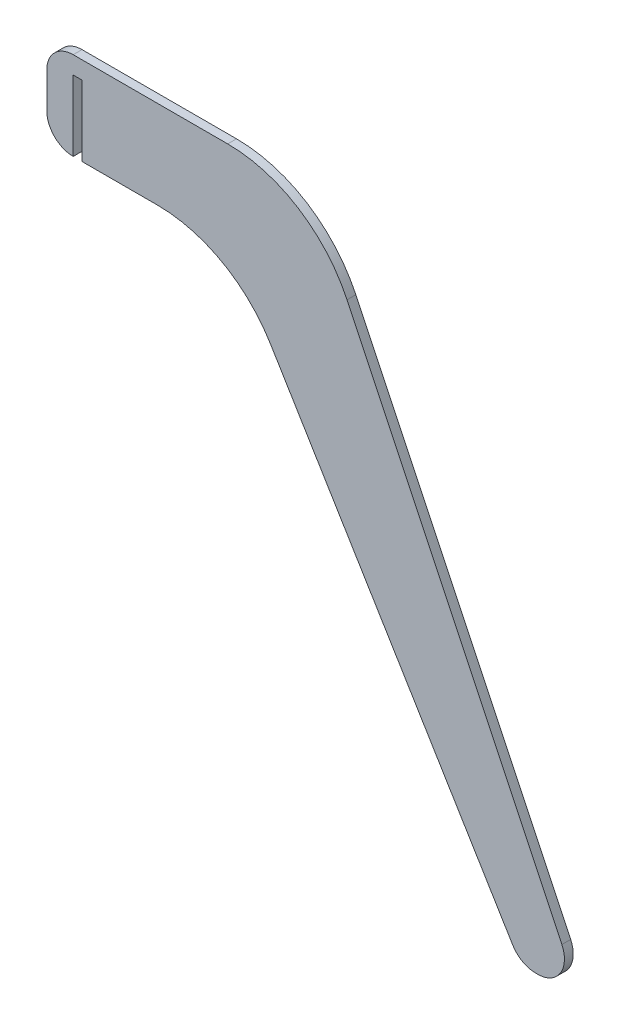
ISO-10303-21;
HEADER;
FILE_DESCRIPTION(('STEP AP214'),'2;1');
FILE_NAME('part.step','',(''),(''),'','','');
FILE_SCHEMA(('AUTOMOTIVE_DESIGN { 1 0 10303 214 1 1 1 1 }'));
ENDSEC;
DATA;
#1=APPLICATION_CONTEXT('core data for automotive mechanical design processes');
#2=APPLICATION_PROTOCOL_DEFINITION('international standard','automotive_design',2000,#1);
#3=PRODUCT_CONTEXT('',#1,'mechanical');
#4=PRODUCT('Part','Part','',(#3));
#5=PRODUCT_RELATED_PRODUCT_CATEGORY('part','',(#4));
#6=PRODUCT_DEFINITION_FORMATION('','',#4);
#7=PRODUCT_DEFINITION_CONTEXT('part definition',#1,'design');
#8=PRODUCT_DEFINITION('design','',#6,#7);
#9=PRODUCT_DEFINITION_SHAPE('','',#8);
#10=(LENGTH_UNIT() NAMED_UNIT(*) SI_UNIT(.MILLI.,.METRE.));
#11=(NAMED_UNIT(*) PLANE_ANGLE_UNIT() SI_UNIT($,.RADIAN.));
#12=(NAMED_UNIT(*) SI_UNIT($,.STERADIAN.) SOLID_ANGLE_UNIT());
#13=UNCERTAINTY_MEASURE_WITH_UNIT(LENGTH_MEASURE(1.E-05),#10,'distance_accuracy_value','');
#14=(GEOMETRIC_REPRESENTATION_CONTEXT(3) GLOBAL_UNCERTAINTY_ASSIGNED_CONTEXT((#13)) GLOBAL_UNIT_ASSIGNED_CONTEXT((#10,
#11,#12)) REPRESENTATION_CONTEXT('',''));
#15=CARTESIAN_POINT('',(0.,0.,0.));
#16=DIRECTION('',(0.,0.,1.));
#17=DIRECTION('',(1.,0.,0.));
#18=AXIS2_PLACEMENT_3D('',#15,#16,#17);
#19=CARTESIAN_POINT('',(0.3,0.,0.1));
#20=DIRECTION('',(-1.,0.,0.));
#21=DIRECTION('',(0.,0.,1.));
#22=AXIS2_PLACEMENT_3D('',#19,#20,#21);
#23=PLANE('',#22);
#24=DIRECTION('',(0.,1.,0.));
#25=VECTOR('',#24,1.);
#26=CARTESIAN_POINT('',(0.3,0.,0.));
#27=LINE('',#26,#25);
#28=CARTESIAN_POINT('',(0.3,0.,0.));
#29=VERTEX_POINT('',#28);
#30=CARTESIAN_POINT('',(0.3,0.8,0.));
#31=VERTEX_POINT('',#30);
#32=EDGE_CURVE('E296',#29,#31,#27,.T.);
#33=ORIENTED_EDGE('',*,*,#32,.T.);
#34=DIRECTION('',(0.,0.,-1.));
#35=VECTOR('',#34,1.);
#36=CARTESIAN_POINT('',(0.3,0.8,0.1));
#37=LINE('',#36,#35);
#38=CARTESIAN_POINT('',(0.3,0.8,0.1));
#39=VERTEX_POINT('',#38);
#40=EDGE_CURVE('E165',#39,#31,#37,.T.);
#41=ORIENTED_EDGE('',*,*,#40,.F.);
#42=DIRECTION('',(0.,1.,0.));
#43=VECTOR('',#42,1.);
#44=CARTESIAN_POINT('',(0.3,0.,0.1));
#45=LINE('',#44,#43);
#46=CARTESIAN_POINT('',(0.3,0.,0.1));
#47=VERTEX_POINT('',#46);
#48=EDGE_CURVE('E150',#47,#39,#45,.T.);
#49=ORIENTED_EDGE('',*,*,#48,.F.);
#50=DIRECTION('',(0.,0.,-1.));
#51=VECTOR('',#50,1.);
#52=CARTESIAN_POINT('',(0.3,0.,0.1));
#53=LINE('',#52,#51);
#54=EDGE_CURVE('E163',#47,#29,#53,.T.);
#55=ORIENTED_EDGE('',*,*,#54,.T.);
#56=EDGE_LOOP('',(#33,#41,#49,#55));
#57=FACE_BOUND('',#56,.T.);
#58=ADVANCED_FACE('F39',(#57),#23,.F.);
#59=CARTESIAN_POINT('',(0.3,0.8,0.1));
#60=DIRECTION('',(0.,1.,0.));
#61=DIRECTION('',(0.,0.,1.));
#62=AXIS2_PLACEMENT_3D('',#59,#60,#61);
#63=PLANE('',#62);
#64=DIRECTION('',(1.,0.,0.));
#65=VECTOR('',#64,1.);
#66=CARTESIAN_POINT('',(0.3,0.8,0.));
#67=LINE('',#66,#65);
#68=CARTESIAN_POINT('',(0.4,0.8,0.));
#69=VERTEX_POINT('',#68);
#70=EDGE_CURVE('E290',#31,#69,#67,.T.);
#71=ORIENTED_EDGE('',*,*,#70,.T.);
#72=DIRECTION('',(0.,0.,-1.));
#73=VECTOR('',#72,1.);
#74=CARTESIAN_POINT('',(0.4,0.8,0.1));
#75=LINE('',#74,#73);
#76=CARTESIAN_POINT('',(0.4,0.8,0.1));
#77=VERTEX_POINT('',#76);
#78=EDGE_CURVE('E182',#77,#69,#75,.T.);
#79=ORIENTED_EDGE('',*,*,#78,.F.);
#80=DIRECTION('',(1.,0.,0.));
#81=VECTOR('',#80,1.);
#82=CARTESIAN_POINT('',(0.3,0.8,0.1));
#83=LINE('',#82,#81);
#84=EDGE_CURVE('E168',#39,#77,#83,.T.);
#85=ORIENTED_EDGE('',*,*,#84,.F.);
#86=ORIENTED_EDGE('',*,*,#40,.T.);
#87=EDGE_LOOP('',(#71,#79,#85,#86));
#88=FACE_BOUND('',#87,.T.);
#89=ADVANCED_FACE('F321',(#88),#63,.F.);
#90=CARTESIAN_POINT('',(0.4,0.8,0.1));
#91=DIRECTION('',(1.,0.,0.));
#92=DIRECTION('',(0.,1.,0.));
#93=AXIS2_PLACEMENT_3D('',#90,#91,#92);
#94=PLANE('',#93);
#95=DIRECTION('',(0.,-1.,0.));
#96=VECTOR('',#95,1.);
#97=CARTESIAN_POINT('',(0.4,0.8,0.));
#98=LINE('',#97,#96);
#99=CARTESIAN_POINT('',(0.4,0.,0.));
#100=VERTEX_POINT('',#99);
#101=EDGE_CURVE('E285',#69,#100,#98,.T.);
#102=ORIENTED_EDGE('',*,*,#101,.T.);
#103=DIRECTION('',(0.,0.,-1.));
#104=VECTOR('',#103,1.);
#105=CARTESIAN_POINT('',(0.4,0.,0.1));
#106=LINE('',#105,#104);
#107=CARTESIAN_POINT('',(0.4,0.,0.1));
#108=VERTEX_POINT('',#107);
#109=EDGE_CURVE('E274',#108,#100,#106,.T.);
#110=ORIENTED_EDGE('',*,*,#109,.F.);
#111=DIRECTION('',(0.,-1.,0.));
#112=VECTOR('',#111,1.);
#113=CARTESIAN_POINT('',(0.4,0.8,0.1));
#114=LINE('',#113,#112);
#115=EDGE_CURVE('E286',#77,#108,#114,.T.);
#116=ORIENTED_EDGE('',*,*,#115,.F.);
#117=ORIENTED_EDGE('',*,*,#78,.T.);
#118=EDGE_LOOP('',(#102,#110,#116,#117));
#119=FACE_BOUND('',#118,.T.);
#120=ADVANCED_FACE('F283',(#119),#94,.F.);
#121=CARTESIAN_POINT('',(0.4,0.,0.1));
#122=DIRECTION('',(0.,1.,0.));
#123=DIRECTION('',(-1.,0.,0.));
#124=AXIS2_PLACEMENT_3D('',#121,#122,#123);
#125=PLANE('',#124);
#126=DIRECTION('',(1.,0.,0.));
#127=VECTOR('',#126,1.);
#128=CARTESIAN_POINT('',(0.4,0.,0.));
#129=LINE('',#128,#127);
#130=CARTESIAN_POINT('',(1.25539714086741,0.,0.));
#131=VERTEX_POINT('',#130);
#132=EDGE_CURVE('E264',#100,#131,#129,.T.);
#133=ORIENTED_EDGE('',*,*,#132,.T.);
#134=DIRECTION('',(0.,0.,-1.));
#135=VECTOR('',#134,1.);
#136=CARTESIAN_POINT('',(1.25539714086741,0.,0.1));
#137=LINE('',#136,#135);
#138=CARTESIAN_POINT('',(1.25539714086741,0.,0.1));
#139=VERTEX_POINT('',#138);
#140=EDGE_CURVE('E180',#131,#139,#137,.F.);
#141=ORIENTED_EDGE('',*,*,#140,.T.);
#142=DIRECTION('',(1.,0.,0.));
#143=VECTOR('',#142,1.);
#144=CARTESIAN_POINT('',(0.4,0.,0.1));
#145=LINE('',#144,#143);
#146=EDGE_CURVE('E314',#108,#139,#145,.T.);
#147=ORIENTED_EDGE('',*,*,#146,.F.);
#148=ORIENTED_EDGE('',*,*,#109,.T.);
#149=EDGE_LOOP('',(#133,#141,#147,#148));
#150=FACE_BOUND('',#149,.T.);
#151=ADVANCED_FACE('F328',(#150),#125,.F.);
#152=CARTESIAN_POINT('',(5.37542131627612,-5.40091248726071,0.1));
#153=DIRECTION('',(0.855047552956308,0.518549594719184,0.));
#154=DIRECTION('',(-0.518549594719184,0.855047552956308,0.));
#155=AXIS2_PLACEMENT_3D('',#152,#153,#154);
#156=PLANE('',#155);
#157=DIRECTION('',(0.518549594719184,-0.855047552956308,0.));
#158=VECTOR('',#157,1.);
#159=CARTESIAN_POINT('',(5.37542131627612,-5.40091248726071,0.));
#160=LINE('',#159,#158);
#161=CARTESIAN_POINT('',(2.53796847030187,-0.722175607921225,0.));
#162=VERTEX_POINT('',#161);
#163=CARTESIAN_POINT('',(5.28782762221574,-5.25647736567647,0.));
#164=VERTEX_POINT('',#163);
#165=EDGE_CURVE('E258',#162,#164,#160,.T.);
#166=ORIENTED_EDGE('',*,*,#165,.T.);
#167=DIRECTION('',(0.,0.,-1.));
#168=VECTOR('',#167,1.);
#169=CARTESIAN_POINT('',(5.28782762221574,-5.25647736567647,0.1));
#170=LINE('',#169,#168);
#171=CARTESIAN_POINT('',(5.28782762221574,-5.25647736567647,0.1));
#172=VERTEX_POINT('',#171);
#173=EDGE_CURVE('E11',#164,#172,#170,.F.);
#174=ORIENTED_EDGE('',*,*,#173,.T.);
#175=DIRECTION('',(0.518549594719184,-0.855047552956308,0.));
#176=VECTOR('',#175,1.);
#177=CARTESIAN_POINT('',(5.37542131627612,-5.40091248726071,0.1));
#178=LINE('',#177,#176);
#179=CARTESIAN_POINT('',(2.53796847030187,-0.722175607921225,0.1));
#180=VERTEX_POINT('',#179);
#181=EDGE_CURVE('E311',#180,#172,#178,.T.);
#182=ORIENTED_EDGE('',*,*,#181,.F.);
#183=DIRECTION('',(0.,0.,-1.));
#184=VECTOR('',#183,1.);
#185=CARTESIAN_POINT('',(2.53796847030187,-0.722175607921224,0.));
#186=LINE('',#185,#184);
#187=EDGE_CURVE('E175',#180,#162,#186,.T.);
#188=ORIENTED_EDGE('',*,*,#187,.T.);
#189=EDGE_LOOP('',(#166,#174,#182,#188));
#190=FACE_BOUND('',#189,.T.);
#191=ADVANCED_FACE('F383',(#190),#156,.F.);
#192=CARTESIAN_POINT('',(6.04949513941477,-5.40091248726071,0.1));
#193=DIRECTION('',(0.,1.,0.));
#194=DIRECTION('',(0.,0.,1.));
#195=AXIS2_PLACEMENT_3D('',#192,#193,#194);
#196=PLANE('',#195);
#197=DIRECTION('',(1.,0.,0.));
#198=VECTOR('',#197,1.);
#199=CARTESIAN_POINT('',(6.04949513941477,-5.40091248726071,0.));
#200=LINE('',#199,#198);
#201=CARTESIAN_POINT('',(5.54434188810264,-5.40091248726071,0.));
#202=VERTEX_POINT('',#201);
#203=CARTESIAN_POINT('',(5.57426414015044,-5.40091248726071,0.));
#204=VERTEX_POINT('',#203);
#205=EDGE_CURVE('E247',#202,#204,#200,.T.);
#206=ORIENTED_EDGE('',*,*,#205,.T.);
#207=DIRECTION('',(0.,0.,-1.));
#208=VECTOR('',#207,1.);
#209=CARTESIAN_POINT('',(5.57426414015044,-5.40091248726071,0.1));
#210=LINE('',#209,#208);
#211=CARTESIAN_POINT('',(5.57426414015044,-5.40091248726071,0.1));
#212=VERTEX_POINT('',#211);
#213=EDGE_CURVE('E48',#204,#212,#210,.F.);
#214=ORIENTED_EDGE('',*,*,#213,.T.);
#215=DIRECTION('',(1.,0.,0.));
#216=VECTOR('',#215,1.);
#217=CARTESIAN_POINT('',(6.04949513941477,-5.40091248726071,0.1));
#218=LINE('',#217,#216);
#219=CARTESIAN_POINT('',(5.54434188810264,-5.40091248726071,0.1));
#220=VERTEX_POINT('',#219);
#221=EDGE_CURVE('E248',#220,#212,#218,.T.);
#222=ORIENTED_EDGE('',*,*,#221,.F.);
#223=DIRECTION('',(0.,0.,-1.));
#224=VECTOR('',#223,1.);
#225=CARTESIAN_POINT('',(5.54434188810264,-5.40091248726071,0.1));
#226=LINE('',#225,#224);
#227=EDGE_CURVE('E240',#220,#202,#226,.T.);
#228=ORIENTED_EDGE('',*,*,#227,.T.);
#229=EDGE_LOOP('',(#206,#214,#222,#228));
#230=FACE_BOUND('',#229,.T.);
#231=ADVANCED_FACE('F246',(#230),#196,.F.);
#232=CARTESIAN_POINT('',(3.,1.,0.1));
#233=DIRECTION('',(-0.902781581302182,-0.430099309998902,0.));
#234=DIRECTION('',(0.430099309998902,-0.902781581302182,0.));
#235=AXIS2_PLACEMENT_3D('',#232,#233,#234);
#236=PLANE('',#235);
#237=DIRECTION('',(-0.430099309998902,0.902781581302182,0.));
#238=VECTOR('',#237,1.);
#239=CARTESIAN_POINT('',(3.,1.,0.1));
#240=LINE('',#239,#238);
#241=CARTESIAN_POINT('',(5.8450986145411,-4.97188269426104,0.1));
#242=VERTEX_POINT('',#241);
#243=CARTESIAN_POINT('',(3.40726444570981,0.145148964998353,0.1));
#244=VERTEX_POINT('',#243);
#245=EDGE_CURVE('E306',#242,#244,#240,.T.);
#246=ORIENTED_EDGE('',*,*,#245,.F.);
#247=DIRECTION('',(0.,0.,-1.));
#248=VECTOR('',#247,1.);
#249=CARTESIAN_POINT('',(5.8450986145411,-4.97188269426104,0.1));
#250=LINE('',#249,#248);
#251=CARTESIAN_POINT('',(5.8450986145411,-4.97188269426104,0.));
#252=VERTEX_POINT('',#251);
#253=EDGE_CURVE('E236',#242,#252,#250,.T.);
#254=ORIENTED_EDGE('',*,*,#253,.T.);
#255=DIRECTION('',(-0.430099309998902,0.902781581302182,0.));
#256=VECTOR('',#255,1.);
#257=CARTESIAN_POINT('',(3.,1.,0.));
#258=LINE('',#257,#256);
#259=CARTESIAN_POINT('',(3.40726444570981,0.145148964998353,0.));
#260=VERTEX_POINT('',#259);
#261=EDGE_CURVE('E257',#252,#260,#258,.T.);
#262=ORIENTED_EDGE('',*,*,#261,.T.);
#263=DIRECTION('',(0.,0.,-1.));
#264=VECTOR('',#263,1.);
#265=CARTESIAN_POINT('',(3.40726444570981,0.145148964998353,0.1));
#266=LINE('',#265,#264);
#267=EDGE_CURVE('E196',#260,#244,#266,.F.);
#268=ORIENTED_EDGE('',*,*,#267,.T.);
#269=EDGE_LOOP('',(#246,#254,#262,#268));
#270=FACE_BOUND('',#269,.T.);
#271=ADVANCED_FACE('F356',(#270),#236,.F.);
#272=CARTESIAN_POINT('',(0.,1.,0.1));
#273=DIRECTION('',(0.,-1.,0.));
#274=DIRECTION('',(0.,0.,-1.));
#275=AXIS2_PLACEMENT_3D('',#272,#273,#274);
#276=PLANE('',#275);
#277=DIRECTION('',(-1.,0.,0.));
#278=VECTOR('',#277,1.);
#279=CARTESIAN_POINT('',(0.,1.,0.));
#280=LINE('',#279,#278);
#281=CARTESIAN_POINT('',(2.05309207375653,1.,0.));
#282=VERTEX_POINT('',#281);
#283=CARTESIAN_POINT('',(0.3,1.,0.));
#284=VERTEX_POINT('',#283);
#285=EDGE_CURVE('E262',#282,#284,#280,.T.);
#286=ORIENTED_EDGE('',*,*,#285,.T.);
#287=DIRECTION('',(0.,0.,-1.));
#288=VECTOR('',#287,1.);
#289=CARTESIAN_POINT('',(0.3,1.,0.1));
#290=LINE('',#289,#288);
#291=CARTESIAN_POINT('',(0.3,1.,0.1));
#292=VERTEX_POINT('',#291);
#293=EDGE_CURVE('E227',#284,#292,#290,.F.);
#294=ORIENTED_EDGE('',*,*,#293,.T.);
#295=DIRECTION('',(-1.,0.,0.));
#296=VECTOR('',#295,1.);
#297=CARTESIAN_POINT('',(0.,1.,0.1));
#298=LINE('',#297,#296);
#299=CARTESIAN_POINT('',(2.05309207375653,1.,0.1));
#300=VERTEX_POINT('',#299);
#301=EDGE_CURVE('E303',#300,#292,#298,.T.);
#302=ORIENTED_EDGE('',*,*,#301,.F.);
#303=DIRECTION('',(0.,0.,-1.));
#304=VECTOR('',#303,1.);
#305=CARTESIAN_POINT('',(2.05309207375653,1.,0.1));
#306=LINE('',#305,#304);
#307=EDGE_CURVE('E188',#300,#282,#306,.T.);
#308=ORIENTED_EDGE('',*,*,#307,.T.);
#309=EDGE_LOOP('',(#286,#294,#302,#308));
#310=FACE_BOUND('',#309,.T.);
#311=ADVANCED_FACE('F363',(#310),#276,.F.);
#312=CARTESIAN_POINT('',(0.,0.,0.1));
#313=DIRECTION('',(1.,0.,0.));
#314=DIRECTION('',(0.,0.,-1.));
#315=AXIS2_PLACEMENT_3D('',#312,#313,#314);
#316=PLANE('',#315);
#317=DIRECTION('',(0.,-1.,0.));
#318=VECTOR('',#317,1.);
#319=CARTESIAN_POINT('',(0.,0.,0.1));
#320=LINE('',#319,#318);
#321=CARTESIAN_POINT('',(0.,0.7,0.1));
#322=VERTEX_POINT('',#321);
#323=CARTESIAN_POINT('',(0.,0.3,0.1));
#324=VERTEX_POINT('',#323);
#325=EDGE_CURVE('E153',#322,#324,#320,.T.);
#326=ORIENTED_EDGE('',*,*,#325,.F.);
#327=DIRECTION('',(0.,0.,-1.));
#328=VECTOR('',#327,1.);
#329=CARTESIAN_POINT('',(0.,0.7,0.1));
#330=LINE('',#329,#328);
#331=CARTESIAN_POINT('',(0.,0.7,0.));
#332=VERTEX_POINT('',#331);
#333=EDGE_CURVE('E212',#322,#332,#330,.T.);
#334=ORIENTED_EDGE('',*,*,#333,.T.);
#335=DIRECTION('',(0.,-1.,0.));
#336=VECTOR('',#335,1.);
#337=CARTESIAN_POINT('',(0.,0.,0.));
#338=LINE('',#337,#336);
#339=CARTESIAN_POINT('',(0.,0.3,0.));
#340=VERTEX_POINT('',#339);
#341=EDGE_CURVE('E169',#332,#340,#338,.T.);
#342=ORIENTED_EDGE('',*,*,#341,.T.);
#343=DIRECTION('',(0.,0.,-1.));
#344=VECTOR('',#343,1.);
#345=CARTESIAN_POINT('',(0.,0.3,0.1));
#346=LINE('',#345,#344);
#347=EDGE_CURVE('E209',#340,#324,#346,.F.);
#348=ORIENTED_EDGE('',*,*,#347,.T.);
#349=EDGE_LOOP('',(#326,#334,#342,#348));
#350=FACE_BOUND('',#349,.T.);
#351=ADVANCED_FACE('F368',(#350),#316,.F.);
#352=CARTESIAN_POINT('',(0.,0.,0.1));
#353=DIRECTION('',(0.,0.,1.));
#354=DIRECTION('',(1.,0.,0.));
#355=AXIS2_PLACEMENT_3D('',#352,#353,#354);
#356=PLANE('',#355);
#357=ORIENTED_EDGE('',*,*,#301,.T.);
#358=CARTESIAN_POINT('',(0.3,0.7,0.1));
#359=DIRECTION('',(0.,0.,1.));
#360=DIRECTION('',(1.,0.,0.));
#361=AXIS2_PLACEMENT_3D('',#358,#359,#360);
#362=CIRCLE('',#361,0.3);
#363=EDGE_CURVE('E158',#292,#322,#362,.T.);
#364=ORIENTED_EDGE('',*,*,#363,.T.);
#365=ORIENTED_EDGE('',*,*,#325,.T.);
#366=CARTESIAN_POINT('',(0.3,0.3,0.1));
#367=DIRECTION('',(0.,0.,1.));
#368=DIRECTION('',(1.,0.,0.));
#369=AXIS2_PLACEMENT_3D('',#366,#367,#368);
#370=CIRCLE('',#369,0.3);
#371=EDGE_CURVE('E146',#324,#47,#370,.T.);
#372=ORIENTED_EDGE('',*,*,#371,.T.);
#373=ORIENTED_EDGE('',*,*,#48,.T.);
#374=ORIENTED_EDGE('',*,*,#84,.T.);
#375=ORIENTED_EDGE('',*,*,#115,.T.);
#376=ORIENTED_EDGE('',*,*,#146,.T.);
#377=CARTESIAN_POINT('',(1.25539714086741,-1.5,0.1));
#378=DIRECTION('',(0.,0.,1.));
#379=DIRECTION('',(1.,0.,0.));
#380=AXIS2_PLACEMENT_3D('',#377,#378,#379);
#381=CIRCLE('',#380,1.5);
#382=EDGE_CURVE('E206',#139,#180,#381,.F.);
#383=ORIENTED_EDGE('',*,*,#382,.T.);
#384=ORIENTED_EDGE('',*,*,#181,.T.);
#385=CARTESIAN_POINT('',(5.54434188810264,-5.10091248726071,0.1));
#386=DIRECTION('',(0.,0.,1.));
#387=DIRECTION('',(1.,0.,0.));
#388=AXIS2_PLACEMENT_3D('',#385,#386,#387);
#389=CIRCLE('',#388,0.3);
#390=EDGE_CURVE('E61',#172,#220,#389,.T.);
#391=ORIENTED_EDGE('',*,*,#390,.T.);
#392=ORIENTED_EDGE('',*,*,#221,.T.);
#393=CARTESIAN_POINT('',(5.57426414015044,-5.10091248726071,0.1));
#394=DIRECTION('',(0.,0.,1.));
#395=DIRECTION('',(1.,0.,0.));
#396=AXIS2_PLACEMENT_3D('',#393,#394,#395);
#397=CIRCLE('',#396,0.3);
#398=EDGE_CURVE('E159',#212,#242,#397,.T.);
#399=ORIENTED_EDGE('',*,*,#398,.T.);
#400=ORIENTED_EDGE('',*,*,#245,.T.);
#401=CARTESIAN_POINT('',(2.05309207375653,-0.5,0.1));
#402=DIRECTION('',(0.,0.,1.));
#403=DIRECTION('',(1.,0.,0.));
#404=AXIS2_PLACEMENT_3D('',#401,#402,#403);
#405=CIRCLE('',#404,1.5);
#406=EDGE_CURVE('E200',#244,#300,#405,.T.);
#407=ORIENTED_EDGE('',*,*,#406,.T.);
#408=EDGE_LOOP('',(#357,#364,#365,#372,#373,#374,#375,#376,#383,#384,#391,#392,#399,#400,#407));
#409=FACE_BOUND('',#408,.T.);
#410=ADVANCED_FACE('F149',(#409),#356,.T.);
#411=CARTESIAN_POINT('',(0.,0.,0.));
#412=DIRECTION('',(0.,0.,1.));
#413=DIRECTION('',(1.,0.,0.));
#414=AXIS2_PLACEMENT_3D('',#411,#412,#413);
#415=PLANE('',#414);
#416=ORIENTED_EDGE('',*,*,#341,.F.);
#417=CARTESIAN_POINT('',(0.3,0.7,0.));
#418=DIRECTION('',(0.,0.,1.));
#419=DIRECTION('',(1.,0.,0.));
#420=AXIS2_PLACEMENT_3D('',#417,#418,#419);
#421=CIRCLE('',#420,0.3);
#422=EDGE_CURVE('E224',#332,#284,#421,.F.);
#423=ORIENTED_EDGE('',*,*,#422,.T.);
#424=ORIENTED_EDGE('',*,*,#285,.F.);
#425=CARTESIAN_POINT('',(2.05309207375653,-0.5,0.));
#426=DIRECTION('',(0.,0.,1.));
#427=DIRECTION('',(1.,0.,0.));
#428=AXIS2_PLACEMENT_3D('',#425,#426,#427);
#429=CIRCLE('',#428,1.5);
#430=EDGE_CURVE('E192',#282,#260,#429,.F.);
#431=ORIENTED_EDGE('',*,*,#430,.T.);
#432=ORIENTED_EDGE('',*,*,#261,.F.);
#433=CARTESIAN_POINT('',(5.57426414015044,-5.10091248726071,0.));
#434=DIRECTION('',(0.,0.,1.));
#435=DIRECTION('',(1.,0.,0.));
#436=AXIS2_PLACEMENT_3D('',#433,#434,#435);
#437=CIRCLE('',#436,0.3);
#438=EDGE_CURVE('E219',#252,#204,#437,.F.);
#439=ORIENTED_EDGE('',*,*,#438,.T.);
#440=ORIENTED_EDGE('',*,*,#205,.F.);
#441=CARTESIAN_POINT('',(5.54434188810264,-5.10091248726071,0.));
#442=DIRECTION('',(0.,0.,1.));
#443=DIRECTION('',(1.,0.,0.));
#444=AXIS2_PLACEMENT_3D('',#441,#442,#443);
#445=CIRCLE('',#444,0.3);
#446=EDGE_CURVE('E216',#202,#164,#445,.F.);
#447=ORIENTED_EDGE('',*,*,#446,.T.);
#448=ORIENTED_EDGE('',*,*,#165,.F.);
#449=CARTESIAN_POINT('',(1.25539714086741,-1.5,0.));
#450=DIRECTION('',(0.,0.,1.));
#451=DIRECTION('',(1.,0.,0.));
#452=AXIS2_PLACEMENT_3D('',#449,#450,#451);
#453=CIRCLE('',#452,1.5);
#454=EDGE_CURVE('E203',#162,#131,#453,.T.);
#455=ORIENTED_EDGE('',*,*,#454,.T.);
#456=ORIENTED_EDGE('',*,*,#132,.F.);
#457=ORIENTED_EDGE('',*,*,#101,.F.);
#458=ORIENTED_EDGE('',*,*,#70,.F.);
#459=ORIENTED_EDGE('',*,*,#32,.F.);
#460=CARTESIAN_POINT('',(0.3,0.3,0.));
#461=DIRECTION('',(0.,0.,1.));
#462=DIRECTION('',(1.,0.,0.));
#463=AXIS2_PLACEMENT_3D('',#460,#461,#462);
#464=CIRCLE('',#463,0.3);
#465=EDGE_CURVE('E172',#29,#340,#464,.F.);
#466=ORIENTED_EDGE('',*,*,#465,.T.);
#467=EDGE_LOOP('',(#416,#423,#424,#431,#432,#439,#440,#447,#448,#455,#456,#457,#458,#459,#466));
#468=FACE_BOUND('',#467,.T.);
#469=ADVANCED_FACE('F252',(#468),#415,.F.);
#470=CARTESIAN_POINT('',(1.25539714086741,-1.5,0.1));
#471=DIRECTION('',(0.,0.,1.));
#472=DIRECTION('',(1.,0.,0.));
#473=AXIS2_PLACEMENT_3D('',#470,#471,#472);
#474=CYLINDRICAL_SURFACE('',#473,1.5);
#475=ORIENTED_EDGE('',*,*,#382,.F.);
#476=ORIENTED_EDGE('',*,*,#140,.F.);
#477=ORIENTED_EDGE('',*,*,#454,.F.);
#478=ORIENTED_EDGE('',*,*,#187,.F.);
#479=EDGE_LOOP('',(#475,#476,#477,#478));
#480=FACE_BOUND('',#479,.T.);
#481=ADVANCED_FACE('F333',(#480),#474,.F.);
#482=CARTESIAN_POINT('',(2.05309207375653,-0.5,0.1));
#483=DIRECTION('',(0.,0.,-1.));
#484=DIRECTION('',(-1.,0.,0.));
#485=AXIS2_PLACEMENT_3D('',#482,#483,#484);
#486=CYLINDRICAL_SURFACE('',#485,1.5);
#487=ORIENTED_EDGE('',*,*,#406,.F.);
#488=ORIENTED_EDGE('',*,*,#267,.F.);
#489=ORIENTED_EDGE('',*,*,#430,.F.);
#490=ORIENTED_EDGE('',*,*,#307,.F.);
#491=EDGE_LOOP('',(#487,#488,#489,#490));
#492=FACE_BOUND('',#491,.T.);
#493=ADVANCED_FACE('F336',(#492),#486,.T.);
#494=CARTESIAN_POINT('',(0.3,0.7,0.1));
#495=DIRECTION('',(0.,0.,-1.));
#496=DIRECTION('',(-1.,0.,0.));
#497=AXIS2_PLACEMENT_3D('',#494,#495,#496);
#498=CYLINDRICAL_SURFACE('',#497,0.3);
#499=ORIENTED_EDGE('',*,*,#363,.F.);
#500=ORIENTED_EDGE('',*,*,#293,.F.);
#501=ORIENTED_EDGE('',*,*,#422,.F.);
#502=ORIENTED_EDGE('',*,*,#333,.F.);
#503=EDGE_LOOP('',(#499,#500,#501,#502));
#504=FACE_BOUND('',#503,.T.);
#505=ADVANCED_FACE('F340',(#504),#498,.T.);
#506=CARTESIAN_POINT('',(0.3,0.3,0.1));
#507=DIRECTION('',(0.,0.,-1.));
#508=DIRECTION('',(-1.,0.,0.));
#509=AXIS2_PLACEMENT_3D('',#506,#507,#508);
#510=CYLINDRICAL_SURFACE('',#509,0.3);
#511=ORIENTED_EDGE('',*,*,#371,.F.);
#512=ORIENTED_EDGE('',*,*,#347,.F.);
#513=ORIENTED_EDGE('',*,*,#465,.F.);
#514=ORIENTED_EDGE('',*,*,#54,.F.);
#515=EDGE_LOOP('',(#511,#512,#513,#514));
#516=FACE_BOUND('',#515,.T.);
#517=ADVANCED_FACE('F171',(#516),#510,.T.);
#518=CARTESIAN_POINT('',(5.57426414015044,-5.10091248726071,0.1));
#519=DIRECTION('',(0.,0.,-1.));
#520=DIRECTION('',(-1.,0.,0.));
#521=AXIS2_PLACEMENT_3D('',#518,#519,#520);
#522=CYLINDRICAL_SURFACE('',#521,0.3);
#523=ORIENTED_EDGE('',*,*,#398,.F.);
#524=ORIENTED_EDGE('',*,*,#213,.F.);
#525=ORIENTED_EDGE('',*,*,#438,.F.);
#526=ORIENTED_EDGE('',*,*,#253,.F.);
#527=EDGE_LOOP('',(#523,#524,#525,#526));
#528=FACE_BOUND('',#527,.T.);
#529=ADVANCED_FACE('F346',(#528),#522,.T.);
#530=CARTESIAN_POINT('',(5.54434188810264,-5.10091248726071,0.1));
#531=DIRECTION('',(0.,0.,-1.));
#532=DIRECTION('',(-1.,0.,0.));
#533=AXIS2_PLACEMENT_3D('',#530,#531,#532);
#534=CYLINDRICAL_SURFACE('',#533,0.3);
#535=ORIENTED_EDGE('',*,*,#390,.F.);
#536=ORIENTED_EDGE('',*,*,#173,.F.);
#537=ORIENTED_EDGE('',*,*,#446,.F.);
#538=ORIENTED_EDGE('',*,*,#227,.F.);
#539=EDGE_LOOP('',(#535,#536,#537,#538));
#540=FACE_BOUND('',#539,.T.);
#541=ADVANCED_FACE('F41',(#540),#534,.T.);
#542=CLOSED_SHELL('',(#58,#89,#120,#151,#191,#231,#271,#311,#351,#410,#469,#481,#493,#505,#517,
#529,#541));
#543=MANIFOLD_SOLID_BREP('B2',#542);
#544=ADVANCED_BREP_SHAPE_REPRESENTATION('',(#18,#543),#14);
#545=SHAPE_DEFINITION_REPRESENTATION(#9,#544);
ENDSEC;
END-ISO-10303-21;
